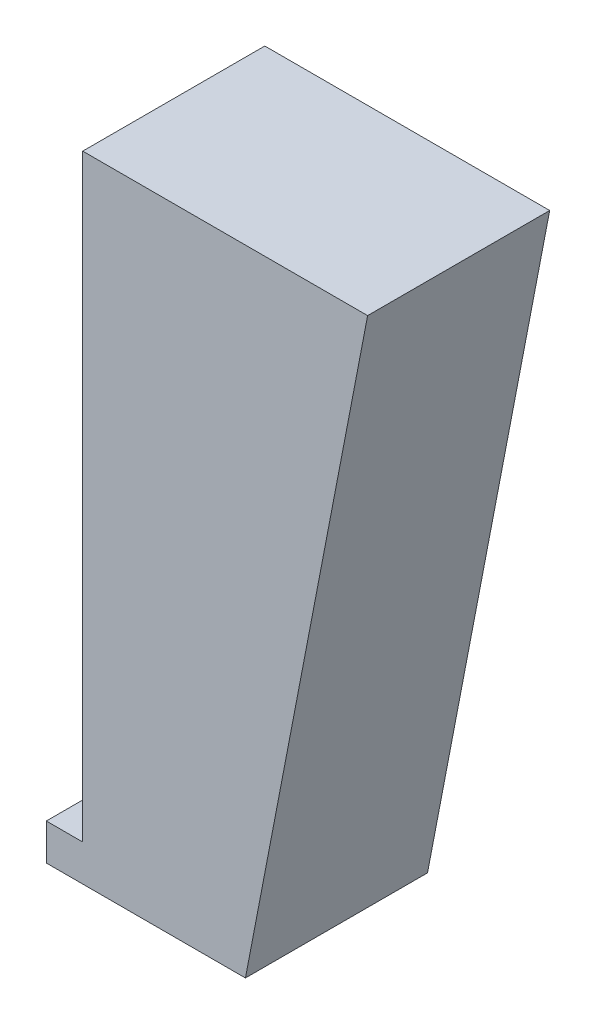
ISO-10303-21;
HEADER;
FILE_DESCRIPTION(('STEP AP214'),'2;1');
FILE_NAME('part.step','',(''),(''),'','','');
FILE_SCHEMA(('AUTOMOTIVE_DESIGN { 1 0 10303 214 1 1 1 1 }'));
ENDSEC;
DATA;
#1=APPLICATION_CONTEXT('core data for automotive mechanical design processes');
#2=APPLICATION_PROTOCOL_DEFINITION('international standard','automotive_design',2000,#1);
#3=PRODUCT_CONTEXT('',#1,'mechanical');
#4=PRODUCT('Part','Part','',(#3));
#5=PRODUCT_RELATED_PRODUCT_CATEGORY('part','',(#4));
#6=PRODUCT_DEFINITION_FORMATION('','',#4);
#7=PRODUCT_DEFINITION_CONTEXT('part definition',#1,'design');
#8=PRODUCT_DEFINITION('design','',#6,#7);
#9=PRODUCT_DEFINITION_SHAPE('','',#8);
#10=(LENGTH_UNIT() NAMED_UNIT(*) SI_UNIT(.MILLI.,.METRE.));
#11=(NAMED_UNIT(*) PLANE_ANGLE_UNIT() SI_UNIT($,.RADIAN.));
#12=(NAMED_UNIT(*) SI_UNIT($,.STERADIAN.) SOLID_ANGLE_UNIT());
#13=UNCERTAINTY_MEASURE_WITH_UNIT(LENGTH_MEASURE(1.E-05),#10,'distance_accuracy_value','');
#14=(GEOMETRIC_REPRESENTATION_CONTEXT(3) GLOBAL_UNCERTAINTY_ASSIGNED_CONTEXT((#13)) GLOBAL_UNIT_ASSIGNED_CONTEXT((#10,
#11,#12)) REPRESENTATION_CONTEXT('',''));
#15=CARTESIAN_POINT('',(0.,0.,0.));
#16=DIRECTION('',(0.,0.,1.));
#17=DIRECTION('',(1.,0.,0.));
#18=AXIS2_PLACEMENT_3D('',#15,#16,#17);
#19=CARTESIAN_POINT('',(0.977813167406262,127.52220329178,35.));
#20=DIRECTION('',(0.,-1.,0.));
#21=DIRECTION('',(0.,0.,-1.));
#22=AXIS2_PLACEMENT_3D('',#19,#20,#21);
#23=PLANE('',#22);
#24=DIRECTION('',(-1.,0.,0.));
#25=VECTOR('',#24,1.);
#26=CARTESIAN_POINT('',(0.977813167406262,127.52220329178,0.));
#27=LINE('',#26,#25);
#28=CARTESIAN_POINT('',(55.7438205753527,127.52220329178,0.));
#29=VERTEX_POINT('',#28);
#30=CARTESIAN_POINT('',(0.977813167406262,127.52220329178,0.));
#31=VERTEX_POINT('',#30);
#32=EDGE_CURVE('E117',#29,#31,#27,.T.);
#33=ORIENTED_EDGE('',*,*,#32,.T.);
#34=DIRECTION('',(0.,0.,-1.));
#35=VECTOR('',#34,1.);
#36=CARTESIAN_POINT('',(0.977813167406262,127.52220329178,35.));
#37=LINE('',#36,#35);
#38=CARTESIAN_POINT('',(0.977813167406262,127.52220329178,35.));
#39=VERTEX_POINT('',#38);
#40=EDGE_CURVE('E11',#39,#31,#37,.T.);
#41=ORIENTED_EDGE('',*,*,#40,.F.);
#42=DIRECTION('',(-1.,0.,0.));
#43=VECTOR('',#42,1.);
#44=CARTESIAN_POINT('',(0.977813167406262,127.52220329178,35.));
#45=LINE('',#44,#43);
#46=CARTESIAN_POINT('',(55.7438205753527,127.52220329178,35.));
#47=VERTEX_POINT('',#46);
#48=EDGE_CURVE('E127',#47,#39,#45,.T.);
#49=ORIENTED_EDGE('',*,*,#48,.F.);
#50=DIRECTION('',(0.,0.,-1.));
#51=VECTOR('',#50,1.);
#52=CARTESIAN_POINT('',(55.7438205753527,127.52220329178,35.));
#53=LINE('',#52,#51);
#54=EDGE_CURVE('E113',#47,#29,#53,.T.);
#55=ORIENTED_EDGE('',*,*,#54,.T.);
#56=EDGE_LOOP('',(#33,#41,#49,#55));
#57=FACE_BOUND('',#56,.T.);
#58=ADVANCED_FACE('F33',(#57),#23,.F.);
#59=CARTESIAN_POINT('',(0.977813167406262,12.5,35.));
#60=DIRECTION('',(1.,0.,0.));
#61=DIRECTION('',(0.,1.,0.));
#62=AXIS2_PLACEMENT_3D('',#59,#60,#61);
#63=PLANE('',#62);
#64=DIRECTION('',(0.,-1.,0.));
#65=VECTOR('',#64,1.);
#66=CARTESIAN_POINT('',(0.977813167406262,12.5,0.));
#67=LINE('',#66,#65);
#68=CARTESIAN_POINT('',(0.977813167406262,12.5,0.));
#69=VERTEX_POINT('',#68);
#70=EDGE_CURVE('E120',#31,#69,#67,.T.);
#71=ORIENTED_EDGE('',*,*,#70,.T.);
#72=DIRECTION('',(0.,0.,-1.));
#73=VECTOR('',#72,1.);
#74=CARTESIAN_POINT('',(0.977813167406262,12.5,35.));
#75=LINE('',#74,#73);
#76=CARTESIAN_POINT('',(0.977813167406262,12.5,35.));
#77=VERTEX_POINT('',#76);
#78=EDGE_CURVE('E41',#77,#69,#75,.T.);
#79=ORIENTED_EDGE('',*,*,#78,.F.);
#80=DIRECTION('',(0.,-1.,0.));
#81=VECTOR('',#80,1.);
#82=CARTESIAN_POINT('',(0.977813167406262,12.5,35.));
#83=LINE('',#82,#81);
#84=EDGE_CURVE('E86',#39,#77,#83,.T.);
#85=ORIENTED_EDGE('',*,*,#84,.F.);
#86=ORIENTED_EDGE('',*,*,#40,.T.);
#87=EDGE_LOOP('',(#71,#79,#85,#86));
#88=FACE_BOUND('',#87,.T.);
#89=ADVANCED_FACE('F151',(#88),#63,.F.);
#90=CARTESIAN_POINT('',(-6.02218683259374,12.5,35.));
#91=DIRECTION('',(0.,-1.,0.));
#92=DIRECTION('',(1.,0.,0.));
#93=AXIS2_PLACEMENT_3D('',#90,#91,#92);
#94=PLANE('',#93);
#95=DIRECTION('',(-1.,0.,0.));
#96=VECTOR('',#95,1.);
#97=CARTESIAN_POINT('',(-6.02218683259374,12.5,0.));
#98=LINE('',#97,#96);
#99=CARTESIAN_POINT('',(-6.02218683259374,12.5,0.));
#100=VERTEX_POINT('',#99);
#101=EDGE_CURVE('E122',#69,#100,#98,.T.);
#102=ORIENTED_EDGE('',*,*,#101,.T.);
#103=DIRECTION('',(0.,0.,-1.));
#104=VECTOR('',#103,1.);
#105=CARTESIAN_POINT('',(-6.02218683259374,12.5,35.));
#106=LINE('',#105,#104);
#107=CARTESIAN_POINT('',(-6.02218683259374,12.5,35.));
#108=VERTEX_POINT('',#107);
#109=EDGE_CURVE('E108',#108,#100,#106,.T.);
#110=ORIENTED_EDGE('',*,*,#109,.F.);
#111=DIRECTION('',(-1.,0.,0.));
#112=VECTOR('',#111,1.);
#113=CARTESIAN_POINT('',(-6.02218683259374,12.5,35.));
#114=LINE('',#113,#112);
#115=EDGE_CURVE('E99',#77,#108,#114,.T.);
#116=ORIENTED_EDGE('',*,*,#115,.F.);
#117=ORIENTED_EDGE('',*,*,#78,.T.);
#118=EDGE_LOOP('',(#102,#110,#116,#117));
#119=FACE_BOUND('',#118,.T.);
#120=ADVANCED_FACE('F133',(#119),#94,.F.);
#121=CARTESIAN_POINT('',(-6.02218683259374,5.50000000000001,35.));
#122=DIRECTION('',(1.,0.,0.));
#123=DIRECTION('',(0.,1.,0.));
#124=AXIS2_PLACEMENT_3D('',#121,#122,#123);
#125=PLANE('',#124);
#126=DIRECTION('',(0.,-1.,0.));
#127=VECTOR('',#126,1.);
#128=CARTESIAN_POINT('',(-6.02218683259374,5.50000000000001,0.));
#129=LINE('',#128,#127);
#130=CARTESIAN_POINT('',(-6.02218683259374,5.50000000000001,0.));
#131=VERTEX_POINT('',#130);
#132=EDGE_CURVE('E107',#100,#131,#129,.T.);
#133=ORIENTED_EDGE('',*,*,#132,.T.);
#134=DIRECTION('',(0.,0.,-1.));
#135=VECTOR('',#134,1.);
#136=CARTESIAN_POINT('',(-6.02218683259374,5.50000000000001,35.));
#137=LINE('',#136,#135);
#138=CARTESIAN_POINT('',(-6.02218683259374,5.50000000000001,35.));
#139=VERTEX_POINT('',#138);
#140=EDGE_CURVE('E104',#139,#131,#137,.T.);
#141=ORIENTED_EDGE('',*,*,#140,.F.);
#142=DIRECTION('',(0.,-1.,0.));
#143=VECTOR('',#142,1.);
#144=CARTESIAN_POINT('',(-6.02218683259374,5.50000000000001,35.));
#145=LINE('',#144,#143);
#146=EDGE_CURVE('E93',#108,#139,#145,.T.);
#147=ORIENTED_EDGE('',*,*,#146,.F.);
#148=ORIENTED_EDGE('',*,*,#109,.T.);
#149=EDGE_LOOP('',(#133,#141,#147,#148));
#150=FACE_BOUND('',#149,.T.);
#151=ADVANCED_FACE('F105',(#150),#125,.F.);
#152=CARTESIAN_POINT('',(32.2555521151129,5.50000000000001,35.));
#153=DIRECTION('',(0.,1.,0.));
#154=DIRECTION('',(0.,0.,1.));
#155=AXIS2_PLACEMENT_3D('',#152,#153,#154);
#156=PLANE('',#155);
#157=DIRECTION('',(1.,0.,0.));
#158=VECTOR('',#157,1.);
#159=CARTESIAN_POINT('',(32.2555521151129,5.50000000000001,0.));
#160=LINE('',#159,#158);
#161=CARTESIAN_POINT('',(32.2555521151129,5.50000000000001,0.));
#162=VERTEX_POINT('',#161);
#163=EDGE_CURVE('E72',#131,#162,#160,.T.);
#164=ORIENTED_EDGE('',*,*,#163,.T.);
#165=DIRECTION('',(0.,0.,-1.));
#166=VECTOR('',#165,1.);
#167=CARTESIAN_POINT('',(32.2555521151129,5.50000000000001,35.));
#168=LINE('',#167,#166);
#169=CARTESIAN_POINT('',(32.2555521151129,5.50000000000001,35.));
#170=VERTEX_POINT('',#169);
#171=EDGE_CURVE('E109',#170,#162,#168,.T.);
#172=ORIENTED_EDGE('',*,*,#171,.F.);
#173=DIRECTION('',(1.,0.,0.));
#174=VECTOR('',#173,1.);
#175=CARTESIAN_POINT('',(32.2555521151129,5.50000000000001,35.));
#176=LINE('',#175,#174);
#177=EDGE_CURVE('E97',#139,#170,#176,.T.);
#178=ORIENTED_EDGE('',*,*,#177,.F.);
#179=ORIENTED_EDGE('',*,*,#140,.T.);
#180=EDGE_LOOP('',(#164,#172,#178,#179));
#181=FACE_BOUND('',#180,.T.);
#182=ADVANCED_FACE('F111',(#181),#156,.F.);
#183=CARTESIAN_POINT('',(55.7438205753527,127.52220329178,35.));
#184=DIRECTION('',(-0.981972911949387,0.189021692399685,0.));
#185=DIRECTION('',(-0.189021692399685,-0.981972911949387,0.));
#186=AXIS2_PLACEMENT_3D('',#183,#184,#185);
#187=PLANE('',#186);
#188=DIRECTION('',(0.189021692399685,0.981972911949387,0.));
#189=VECTOR('',#188,1.);
#190=CARTESIAN_POINT('',(55.7438205753527,127.52220329178,0.));
#191=LINE('',#190,#189);
#192=EDGE_CURVE('E78',#162,#29,#191,.T.);
#193=ORIENTED_EDGE('',*,*,#192,.T.);
#194=ORIENTED_EDGE('',*,*,#54,.F.);
#195=DIRECTION('',(0.189021692399685,0.981972911949387,0.));
#196=VECTOR('',#195,1.);
#197=CARTESIAN_POINT('',(55.7438205753527,127.52220329178,35.));
#198=LINE('',#197,#196);
#199=EDGE_CURVE('E49',#170,#47,#198,.T.);
#200=ORIENTED_EDGE('',*,*,#199,.F.);
#201=ORIENTED_EDGE('',*,*,#171,.T.);
#202=EDGE_LOOP('',(#193,#194,#200,#201));
#203=FACE_BOUND('',#202,.T.);
#204=ADVANCED_FACE('F140',(#203),#187,.F.);
#205=CARTESIAN_POINT('',(0.,0.,35.));
#206=DIRECTION('',(0.,0.,1.));
#207=DIRECTION('',(1.,0.,0.));
#208=AXIS2_PLACEMENT_3D('',#205,#206,#207);
#209=PLANE('',#208);
#210=ORIENTED_EDGE('',*,*,#48,.T.);
#211=ORIENTED_EDGE('',*,*,#84,.T.);
#212=ORIENTED_EDGE('',*,*,#115,.T.);
#213=ORIENTED_EDGE('',*,*,#146,.T.);
#214=ORIENTED_EDGE('',*,*,#177,.T.);
#215=ORIENTED_EDGE('',*,*,#199,.T.);
#216=EDGE_LOOP('',(#210,#211,#212,#213,#214,#215));
#217=FACE_BOUND('',#216,.T.);
#218=ADVANCED_FACE('F95',(#217),#209,.T.);
#219=CARTESIAN_POINT('',(0.,0.,0.));
#220=DIRECTION('',(0.,0.,1.));
#221=DIRECTION('',(1.,0.,0.));
#222=AXIS2_PLACEMENT_3D('',#219,#220,#221);
#223=PLANE('',#222);
#224=ORIENTED_EDGE('',*,*,#32,.F.);
#225=ORIENTED_EDGE('',*,*,#192,.F.);
#226=ORIENTED_EDGE('',*,*,#163,.F.);
#227=ORIENTED_EDGE('',*,*,#132,.F.);
#228=ORIENTED_EDGE('',*,*,#101,.F.);
#229=ORIENTED_EDGE('',*,*,#70,.F.);
#230=EDGE_LOOP('',(#224,#225,#226,#227,#228,#229));
#231=FACE_BOUND('',#230,.T.);
#232=ADVANCED_FACE('F136',(#231),#223,.F.);
#233=CLOSED_SHELL('',(#58,#89,#120,#151,#182,#204,#218,#232));
#234=MANIFOLD_SOLID_BREP('B2',#233);
#235=ADVANCED_BREP_SHAPE_REPRESENTATION('',(#18,#234),#14);
#236=SHAPE_DEFINITION_REPRESENTATION(#9,#235);
ENDSEC;
END-ISO-10303-21;
